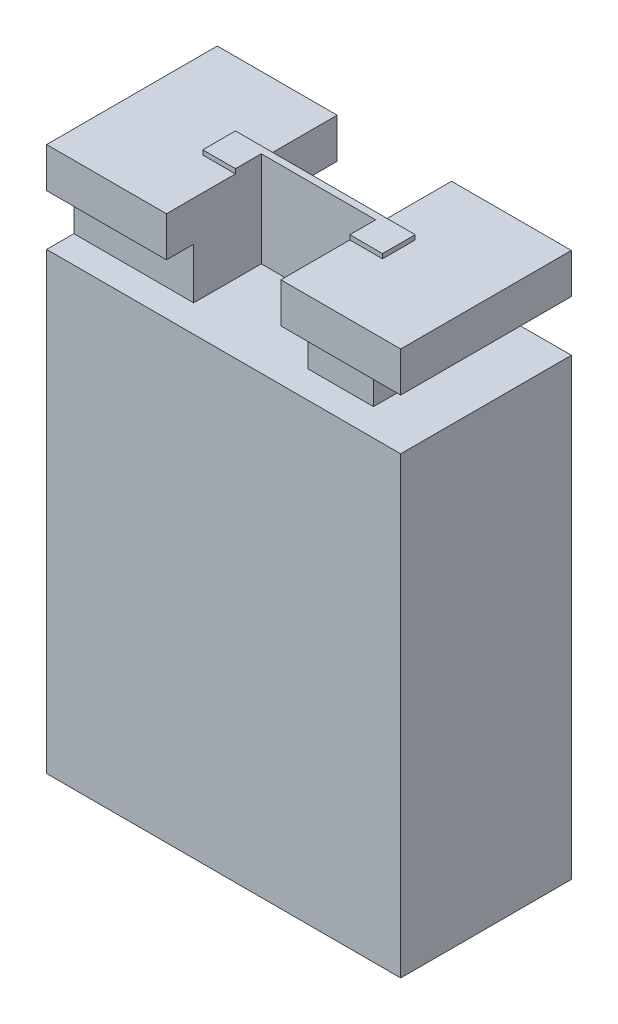
ISO-10303-21;
HEADER;
FILE_DESCRIPTION(('STEP AP214'),'2;1');
FILE_NAME('part.step','',(''),(''),'','','');
FILE_SCHEMA(('AUTOMOTIVE_DESIGN { 1 0 10303 214 1 1 1 1 }'));
ENDSEC;
DATA;
#1=APPLICATION_CONTEXT('core data for automotive mechanical design processes');
#2=APPLICATION_PROTOCOL_DEFINITION('international standard','automotive_design',2000,#1);
#3=PRODUCT_CONTEXT('',#1,'mechanical');
#4=PRODUCT('Part','Part','',(#3));
#5=PRODUCT_RELATED_PRODUCT_CATEGORY('part','',(#4));
#6=PRODUCT_DEFINITION_FORMATION('','',#4);
#7=PRODUCT_DEFINITION_CONTEXT('part definition',#1,'design');
#8=PRODUCT_DEFINITION('design','',#6,#7);
#9=PRODUCT_DEFINITION_SHAPE('','',#8);
#10=(LENGTH_UNIT() NAMED_UNIT(*) SI_UNIT(.MILLI.,.METRE.));
#11=(NAMED_UNIT(*) PLANE_ANGLE_UNIT() SI_UNIT($,.RADIAN.));
#12=(NAMED_UNIT(*) SI_UNIT($,.STERADIAN.) SOLID_ANGLE_UNIT());
#13=UNCERTAINTY_MEASURE_WITH_UNIT(LENGTH_MEASURE(1.E-05),#10,'distance_accuracy_value','');
#14=(GEOMETRIC_REPRESENTATION_CONTEXT(3) GLOBAL_UNCERTAINTY_ASSIGNED_CONTEXT((#13)) GLOBAL_UNIT_ASSIGNED_CONTEXT((#10,
#11,#12)) REPRESENTATION_CONTEXT('',''));
#15=CARTESIAN_POINT('',(0.,0.,0.));
#16=DIRECTION('',(0.,0.,1.));
#17=DIRECTION('',(1.,0.,0.));
#18=AXIS2_PLACEMENT_3D('',#15,#16,#17);
#19=CARTESIAN_POINT('',(2.47649999999999,7.62,-1.19379999999999));
#20=DIRECTION('',(0.,-1.,0.));
#21=DIRECTION('',(0.,0.,-1.));
#22=AXIS2_PLACEMENT_3D('',#19,#20,#21);
#23=PLANE('',#22);
#24=DIRECTION('',(-1.,0.,0.));
#25=VECTOR('',#24,1.);
#26=CARTESIAN_POINT('',(0.8001,7.62,-0.228599999999988));
#27=LINE('',#26,#25);
#28=CARTESIAN_POINT('',(1.2573,7.62,-0.228599999999988));
#29=VERTEX_POINT('',#28);
#30=CARTESIAN_POINT('',(0.8001,7.62,-0.228599999999988));
#31=VERTEX_POINT('',#30);
#32=EDGE_CURVE('E50',#29,#31,#27,.T.);
#33=ORIENTED_EDGE('',*,*,#32,.F.);
#34=DIRECTION('',(0.,0.,-1.));
#35=VECTOR('',#34,1.);
#36=CARTESIAN_POINT('',(1.2573,7.62,-0.228599999999988));
#37=LINE('',#36,#35);
#38=CARTESIAN_POINT('',(1.2573,7.62,0.228600000000012));
#39=VERTEX_POINT('',#38);
#40=EDGE_CURVE('E54',#39,#29,#37,.T.);
#41=ORIENTED_EDGE('',*,*,#40,.F.);
#42=DIRECTION('',(1.,0.,0.));
#43=VECTOR('',#42,1.);
#44=CARTESIAN_POINT('',(0.8001,7.62,0.228600000000012));
#45=LINE('',#44,#43);
#46=CARTESIAN_POINT('',(0.8001,7.62,0.228600000000012));
#47=VERTEX_POINT('',#46);
#48=EDGE_CURVE('E280',#47,#39,#45,.T.);
#49=ORIENTED_EDGE('',*,*,#48,.F.);
#50=DIRECTION('',(0.,0.,-1.));
#51=VECTOR('',#50,1.);
#52=CARTESIAN_POINT('',(0.8001,7.62,1.19380000000001));
#53=LINE('',#52,#51);
#54=CARTESIAN_POINT('',(0.8001,7.62,1.19380000000001));
#55=VERTEX_POINT('',#54);
#56=EDGE_CURVE('E343',#55,#47,#53,.T.);
#57=ORIENTED_EDGE('',*,*,#56,.F.);
#58=DIRECTION('',(1.,0.,0.));
#59=VECTOR('',#58,1.);
#60=CARTESIAN_POINT('',(-2.47649999999999,7.62,1.19380000000001));
#61=LINE('',#60,#59);
#62=CARTESIAN_POINT('',(2.47649999999999,7.62,1.19380000000001));
#63=VERTEX_POINT('',#62);
#64=EDGE_CURVE('E386',#55,#63,#61,.T.);
#65=ORIENTED_EDGE('',*,*,#64,.T.);
#66=DIRECTION('',(0.,0.,-1.));
#67=VECTOR('',#66,1.);
#68=CARTESIAN_POINT('',(2.47649999999999,7.62,1.19380000000001));
#69=LINE('',#68,#67);
#70=CARTESIAN_POINT('',(2.47649999999999,7.62,-1.19379999999999));
#71=VERTEX_POINT('',#70);
#72=EDGE_CURVE('E372',#63,#71,#69,.T.);
#73=ORIENTED_EDGE('',*,*,#72,.T.);
#74=DIRECTION('',(-1.,0.,0.));
#75=VECTOR('',#74,1.);
#76=CARTESIAN_POINT('',(-2.47649999999999,7.62,-1.19379999999999));
#77=LINE('',#76,#75);
#78=CARTESIAN_POINT('',(0.8001,7.62,-1.19379999999999));
#79=VERTEX_POINT('',#78);
#80=EDGE_CURVE('E389',#71,#79,#77,.T.);
#81=ORIENTED_EDGE('',*,*,#80,.T.);
#82=DIRECTION('',(0.,0.,-1.));
#83=VECTOR('',#82,1.);
#84=CARTESIAN_POINT('',(0.8001,7.62,-0.228599999999988));
#85=LINE('',#84,#83);
#86=EDGE_CURVE('E297',#31,#79,#85,.T.);
#87=ORIENTED_EDGE('',*,*,#86,.F.);
#88=EDGE_LOOP('',(#33,#41,#49,#57,#65,#73,#81,#87));
#89=FACE_BOUND('',#88,.T.);
#90=ADVANCED_FACE('F33',(#89),#23,.F.);
#91=CARTESIAN_POINT('',(-0.8001,7.62,-0.228599999999988));
#92=VERTEX_POINT('',#91);
#93=CARTESIAN_POINT('',(-1.2573,7.62,-0.228599999999988));
#94=VERTEX_POINT('',#93);
#95=EDGE_CURVE('E11',#92,#94,#27,.T.);
#96=ORIENTED_EDGE('',*,*,#95,.F.);
#97=DIRECTION('',(0.,0.,1.));
#98=VECTOR('',#97,1.);
#99=CARTESIAN_POINT('',(-0.8001,7.62,-0.228599999999988));
#100=LINE('',#99,#98);
#101=CARTESIAN_POINT('',(-0.8001,7.62,-1.19379999999999));
#102=VERTEX_POINT('',#101);
#103=EDGE_CURVE('E248',#102,#92,#100,.T.);
#104=ORIENTED_EDGE('',*,*,#103,.F.);
#105=CARTESIAN_POINT('',(-2.47649999999999,7.62,-1.19379999999999));
#106=VERTEX_POINT('',#105);
#107=EDGE_CURVE('E392',#102,#106,#77,.T.);
#108=ORIENTED_EDGE('',*,*,#107,.T.);
#109=DIRECTION('',(0.,0.,1.));
#110=VECTOR('',#109,1.);
#111=CARTESIAN_POINT('',(-2.47649999999999,7.62,1.19380000000001));
#112=LINE('',#111,#110);
#113=CARTESIAN_POINT('',(-2.47649999999999,7.62,1.19380000000001));
#114=VERTEX_POINT('',#113);
#115=EDGE_CURVE('E387',#106,#114,#112,.T.);
#116=ORIENTED_EDGE('',*,*,#115,.T.);
#117=CARTESIAN_POINT('',(-0.8001,7.62,1.19380000000001));
#118=VERTEX_POINT('',#117);
#119=EDGE_CURVE('E383',#114,#118,#61,.T.);
#120=ORIENTED_EDGE('',*,*,#119,.T.);
#121=DIRECTION('',(0.,0.,1.));
#122=VECTOR('',#121,1.);
#123=CARTESIAN_POINT('',(-0.8001,7.62,1.19380000000001));
#124=LINE('',#123,#122);
#125=CARTESIAN_POINT('',(-0.8001,7.62,0.228600000000012));
#126=VERTEX_POINT('',#125);
#127=EDGE_CURVE('E338',#126,#118,#124,.T.);
#128=ORIENTED_EDGE('',*,*,#127,.F.);
#129=DIRECTION('',(1.,0.,0.));
#130=VECTOR('',#129,1.);
#131=CARTESIAN_POINT('',(-0.8001,7.62,0.228600000000012));
#132=LINE('',#131,#130);
#133=CARTESIAN_POINT('',(-1.2573,7.62,0.228600000000012));
#134=VERTEX_POINT('',#133);
#135=EDGE_CURVE('E272',#134,#126,#132,.T.);
#136=ORIENTED_EDGE('',*,*,#135,.F.);
#137=DIRECTION('',(0.,0.,1.));
#138=VECTOR('',#137,1.);
#139=CARTESIAN_POINT('',(-1.2573,7.62,-0.228599999999988));
#140=LINE('',#139,#138);
#141=EDGE_CURVE('E270',#94,#134,#140,.T.);
#142=ORIENTED_EDGE('',*,*,#141,.F.);
#143=EDGE_LOOP('',(#96,#104,#108,#116,#120,#128,#136,#142));
#144=FACE_BOUND('',#143,.T.);
#145=ADVANCED_FACE('F532',(#144),#23,.F.);
#146=CARTESIAN_POINT('',(-2.47649999999999,7.0612,1.19380000000001));
#147=DIRECTION('',(0.,1.,0.));
#148=DIRECTION('',(0.,0.,1.));
#149=AXIS2_PLACEMENT_3D('',#146,#147,#148);
#150=PLANE('',#149);
#151=DIRECTION('',(1.,0.,0.));
#152=VECTOR('',#151,1.);
#153=CARTESIAN_POINT('',(-2.47649999999999,7.0612,-0.812799999999988));
#154=LINE('',#153,#152);
#155=CARTESIAN_POINT('',(0.8001,7.0612,-0.812799999999988));
#156=VERTEX_POINT('',#155);
#157=CARTESIAN_POINT('',(1.71449999999999,7.0612,-0.812799999999988));
#158=VERTEX_POINT('',#157);
#159=EDGE_CURVE('E427',#156,#158,#154,.T.);
#160=ORIENTED_EDGE('',*,*,#159,.F.);
#161=DIRECTION('',(0.,0.,-1.));
#162=VECTOR('',#161,1.);
#163=CARTESIAN_POINT('',(0.8001,7.0612,1.19380000000001));
#164=LINE('',#163,#162);
#165=CARTESIAN_POINT('',(0.8001,7.0612,-1.19379999999999));
#166=VERTEX_POINT('',#165);
#167=EDGE_CURVE('E335',#156,#166,#164,.T.);
#168=ORIENTED_EDGE('',*,*,#167,.T.);
#169=DIRECTION('',(1.,0.,0.));
#170=VECTOR('',#169,1.);
#171=CARTESIAN_POINT('',(-2.47649999999999,7.0612,-1.19379999999999));
#172=LINE('',#171,#170);
#173=CARTESIAN_POINT('',(2.47649999999999,7.0612,-1.19379999999999));
#174=VERTEX_POINT('',#173);
#175=EDGE_CURVE('E428',#166,#174,#172,.T.);
#176=ORIENTED_EDGE('',*,*,#175,.T.);
#177=DIRECTION('',(0.,0.,1.));
#178=VECTOR('',#177,1.);
#179=CARTESIAN_POINT('',(2.47649999999999,7.0612,1.19380000000001));
#180=LINE('',#179,#178);
#181=CARTESIAN_POINT('',(2.47649999999999,7.0612,1.19380000000001));
#182=VERTEX_POINT('',#181);
#183=EDGE_CURVE('E409',#174,#182,#180,.T.);
#184=ORIENTED_EDGE('',*,*,#183,.T.);
#185=DIRECTION('',(1.,0.,0.));
#186=VECTOR('',#185,1.);
#187=CARTESIAN_POINT('',(-2.47649999999999,7.0612,1.19380000000001));
#188=LINE('',#187,#186);
#189=CARTESIAN_POINT('',(0.8001,7.0612,1.19380000000001));
#190=VERTEX_POINT('',#189);
#191=EDGE_CURVE('E406',#190,#182,#188,.T.);
#192=ORIENTED_EDGE('',*,*,#191,.F.);
#193=DIRECTION('',(0.,0.,-1.));
#194=VECTOR('',#193,1.);
#195=CARTESIAN_POINT('',(0.8001,7.0612,1.19380000000001));
#196=LINE('',#195,#194);
#197=CARTESIAN_POINT('',(0.8001,7.0612,0.812800000000012));
#198=VERTEX_POINT('',#197);
#199=EDGE_CURVE('E458',#190,#198,#196,.T.);
#200=ORIENTED_EDGE('',*,*,#199,.T.);
#201=DIRECTION('',(1.,0.,0.));
#202=VECTOR('',#201,1.);
#203=CARTESIAN_POINT('',(-2.47649999999999,7.0612,0.812800000000012));
#204=LINE('',#203,#202);
#205=CARTESIAN_POINT('',(1.71449999999999,7.0612,0.812800000000012));
#206=VERTEX_POINT('',#205);
#207=EDGE_CURVE('E402',#198,#206,#204,.T.);
#208=ORIENTED_EDGE('',*,*,#207,.T.);
#209=DIRECTION('',(0.,0.,1.));
#210=VECTOR('',#209,1.);
#211=CARTESIAN_POINT('',(1.71449999999999,7.0612,-1.19479999999999));
#212=LINE('',#211,#210);
#213=EDGE_CURVE('E447',#158,#206,#212,.T.);
#214=ORIENTED_EDGE('',*,*,#213,.F.);
#215=EDGE_LOOP('',(#160,#168,#176,#184,#192,#200,#208,#214));
#216=FACE_BOUND('',#215,.T.);
#217=ADVANCED_FACE('F524',(#216),#150,.F.);
#218=CARTESIAN_POINT('',(-2.47649999999999,7.62,-1.19379999999999));
#219=DIRECTION('',(0.,0.,1.));
#220=DIRECTION('',(1.,0.,0.));
#221=AXIS2_PLACEMENT_3D('',#218,#219,#220);
#222=PLANE('',#221);
#223=ORIENTED_EDGE('',*,*,#175,.F.);
#224=DIRECTION('',(0.,1.,0.));
#225=VECTOR('',#224,1.);
#226=CARTESIAN_POINT('',(0.8001,4.27174834131522,-1.19379999999999));
#227=LINE('',#226,#225);
#228=EDGE_CURVE('E329',#166,#79,#227,.T.);
#229=ORIENTED_EDGE('',*,*,#228,.T.);
#230=ORIENTED_EDGE('',*,*,#80,.F.);
#231=DIRECTION('',(0.,-1.,0.));
#232=VECTOR('',#231,1.);
#233=CARTESIAN_POINT('',(2.47649999999999,7.62,-1.19379999999999));
#234=LINE('',#233,#232);
#235=EDGE_CURVE('E353',#71,#174,#234,.T.);
#236=ORIENTED_EDGE('',*,*,#235,.T.);
#237=EDGE_LOOP('',(#223,#229,#230,#236));
#238=FACE_BOUND('',#237,.T.);
#239=ADVANCED_FACE('F654',(#238),#222,.F.);
#240=CARTESIAN_POINT('',(-2.47649999999999,7.0612,-0.812799999999988));
#241=DIRECTION('',(0.,0.,1.));
#242=DIRECTION('',(0.,-1.,0.));
#243=AXIS2_PLACEMENT_3D('',#240,#241,#242);
#244=PLANE('',#243);
#245=DIRECTION('',(1.,0.,0.));
#246=VECTOR('',#245,1.);
#247=CARTESIAN_POINT('',(-2.47649999999999,6.35,-0.812799999999988));
#248=LINE('',#247,#246);
#249=CARTESIAN_POINT('',(0.8001,6.35,-0.812799999999988));
#250=VERTEX_POINT('',#249);
#251=CARTESIAN_POINT('',(1.71449999999999,6.35,-0.812799999999988));
#252=VERTEX_POINT('',#251);
#253=EDGE_CURVE('E432',#250,#252,#248,.T.);
#254=ORIENTED_EDGE('',*,*,#253,.F.);
#255=DIRECTION('',(0.,1.,0.));
#256=VECTOR('',#255,1.);
#257=CARTESIAN_POINT('',(0.8001,7.0612,-0.812799999999988));
#258=LINE('',#257,#256);
#259=EDGE_CURVE('E42',#250,#156,#258,.T.);
#260=ORIENTED_EDGE('',*,*,#259,.T.);
#261=ORIENTED_EDGE('',*,*,#159,.T.);
#262=DIRECTION('',(0.,1.,0.));
#263=VECTOR('',#262,1.);
#264=CARTESIAN_POINT('',(1.71449999999999,6.35,-0.812799999999988));
#265=LINE('',#264,#263);
#266=EDGE_CURVE('E455',#252,#158,#265,.T.);
#267=ORIENTED_EDGE('',*,*,#266,.F.);
#268=EDGE_LOOP('',(#254,#260,#261,#267));
#269=FACE_BOUND('',#268,.T.);
#270=ADVANCED_FACE('F548',(#269),#244,.F.);
#271=CARTESIAN_POINT('',(-2.47649999999999,7.62,1.19380000000001));
#272=DIRECTION('',(0.,0.,-1.));
#273=DIRECTION('',(-1.,0.,0.));
#274=AXIS2_PLACEMENT_3D('',#271,#272,#273);
#275=PLANE('',#274);
#276=ORIENTED_EDGE('',*,*,#64,.F.);
#277=DIRECTION('',(0.,1.,0.));
#278=VECTOR('',#277,1.);
#279=CARTESIAN_POINT('',(0.8001,4.27174834131522,1.19380000000001));
#280=LINE('',#279,#278);
#281=EDGE_CURVE('E346',#190,#55,#280,.T.);
#282=ORIENTED_EDGE('',*,*,#281,.F.);
#283=ORIENTED_EDGE('',*,*,#191,.T.);
#284=DIRECTION('',(0.,-1.,0.));
#285=VECTOR('',#284,1.);
#286=CARTESIAN_POINT('',(2.47649999999999,7.62,1.19380000000001));
#287=LINE('',#286,#285);
#288=EDGE_CURVE('E365',#63,#182,#287,.T.);
#289=ORIENTED_EDGE('',*,*,#288,.F.);
#290=EDGE_LOOP('',(#276,#282,#283,#289));
#291=FACE_BOUND('',#290,.T.);
#292=ADVANCED_FACE('F528',(#291),#275,.F.);
#293=CARTESIAN_POINT('',(-2.47649999999999,7.0612,-1.19379999999999));
#294=VERTEX_POINT('',#293);
#295=CARTESIAN_POINT('',(-0.8001,7.0612,-1.19379999999999));
#296=VERTEX_POINT('',#295);
#297=EDGE_CURVE('E424',#294,#296,#172,.T.);
#298=ORIENTED_EDGE('',*,*,#297,.T.);
#299=DIRECTION('',(0.,0.,1.));
#300=VECTOR('',#299,1.);
#301=CARTESIAN_POINT('',(-0.8001,7.0612,1.19380000000001));
#302=LINE('',#301,#300);
#303=CARTESIAN_POINT('',(-0.8001,7.0612,-0.812799999999988));
#304=VERTEX_POINT('',#303);
#305=EDGE_CURVE('E291',#296,#304,#302,.T.);
#306=ORIENTED_EDGE('',*,*,#305,.T.);
#307=CARTESIAN_POINT('',(-2.47649999999999,7.0612,-0.812799999999988));
#308=VERTEX_POINT('',#307);
#309=EDGE_CURVE('E429',#308,#304,#154,.T.);
#310=ORIENTED_EDGE('',*,*,#309,.F.);
#311=DIRECTION('',(0.,0.,1.));
#312=VECTOR('',#311,1.);
#313=CARTESIAN_POINT('',(-2.47649999999999,7.0612,-1.19379999999999));
#314=LINE('',#313,#312);
#315=EDGE_CURVE('E443',#294,#308,#314,.T.);
#316=ORIENTED_EDGE('',*,*,#315,.F.);
#317=EDGE_LOOP('',(#298,#306,#310,#316));
#318=FACE_BOUND('',#317,.T.);
#319=ADVANCED_FACE('F525',(#318),#150,.F.);
#320=CARTESIAN_POINT('',(-2.47649999999999,7.0612,0.812800000000012));
#321=DIRECTION('',(0.,0.,-1.));
#322=DIRECTION('',(-1.,0.,0.));
#323=AXIS2_PLACEMENT_3D('',#320,#321,#322);
#324=PLANE('',#323);
#325=ORIENTED_EDGE('',*,*,#207,.F.);
#326=DIRECTION('',(0.,-1.,0.));
#327=VECTOR('',#326,1.);
#328=CARTESIAN_POINT('',(0.8001,7.0612,0.812800000000012));
#329=LINE('',#328,#327);
#330=CARTESIAN_POINT('',(0.8001,6.35,0.812800000000012));
#331=VERTEX_POINT('',#330);
#332=EDGE_CURVE('E461',#198,#331,#329,.T.);
#333=ORIENTED_EDGE('',*,*,#332,.T.);
#334=DIRECTION('',(1.,0.,0.));
#335=VECTOR('',#334,1.);
#336=CARTESIAN_POINT('',(-2.47649999999999,6.35,0.812800000000012));
#337=LINE('',#336,#335);
#338=CARTESIAN_POINT('',(1.71449999999999,6.35,0.812800000000012));
#339=VERTEX_POINT('',#338);
#340=EDGE_CURVE('E397',#331,#339,#337,.T.);
#341=ORIENTED_EDGE('',*,*,#340,.T.);
#342=DIRECTION('',(0.,-1.,0.));
#343=VECTOR('',#342,1.);
#344=CARTESIAN_POINT('',(1.71449999999999,6.35,0.812800000000012));
#345=LINE('',#344,#343);
#346=EDGE_CURVE('E450',#206,#339,#345,.T.);
#347=ORIENTED_EDGE('',*,*,#346,.F.);
#348=EDGE_LOOP('',(#325,#333,#341,#347));
#349=FACE_BOUND('',#348,.T.);
#350=ADVANCED_FACE('F543',(#349),#324,.F.);
#351=CARTESIAN_POINT('',(2.47649999999999,7.62,1.19380000000001));
#352=DIRECTION('',(-1.,0.,0.));
#353=DIRECTION('',(0.,0.,1.));
#354=AXIS2_PLACEMENT_3D('',#351,#352,#353);
#355=PLANE('',#354);
#356=CARTESIAN_POINT('',(2.47649999999999,6.35,-1.19379999999999));
#357=VERTEX_POINT('',#356);
#358=CARTESIAN_POINT('',(2.47649999999999,0.,-1.19379999999999));
#359=VERTEX_POINT('',#358);
#360=EDGE_CURVE('E356',#357,#359,#234,.T.);
#361=ORIENTED_EDGE('',*,*,#360,.F.);
#362=DIRECTION('',(0.,0.,-1.));
#363=VECTOR('',#362,1.);
#364=CARTESIAN_POINT('',(2.47649999999999,6.35,1.19380000000001));
#365=LINE('',#364,#363);
#366=CARTESIAN_POINT('',(2.47649999999999,6.35,1.19380000000001));
#367=VERTEX_POINT('',#366);
#368=EDGE_CURVE('E413',#367,#357,#365,.T.);
#369=ORIENTED_EDGE('',*,*,#368,.F.);
#370=CARTESIAN_POINT('',(2.47649999999999,0.,1.19380000000001));
#371=VERTEX_POINT('',#370);
#372=EDGE_CURVE('E368',#367,#371,#287,.T.);
#373=ORIENTED_EDGE('',*,*,#372,.T.);
#374=DIRECTION('',(0.,0.,-1.));
#375=VECTOR('',#374,1.);
#376=CARTESIAN_POINT('',(2.47649999999999,0.,1.19380000000001));
#377=LINE('',#376,#375);
#378=EDGE_CURVE('E379',#371,#359,#377,.T.);
#379=ORIENTED_EDGE('',*,*,#378,.T.);
#380=EDGE_LOOP('',(#361,#369,#373,#379));
#381=FACE_BOUND('',#380,.T.);
#382=ADVANCED_FACE('F505',(#381),#355,.F.);
#383=DIRECTION('',(0.,-1.,0.));
#384=VECTOR('',#383,1.);
#385=CARTESIAN_POINT('',(-2.47649999999999,7.62,-1.19379999999999));
#386=LINE('',#385,#384);
#387=CARTESIAN_POINT('',(-2.47649999999999,6.35,-1.19379999999999));
#388=VERTEX_POINT('',#387);
#389=CARTESIAN_POINT('',(-2.47649999999999,0.,-1.19379999999999));
#390=VERTEX_POINT('',#389);
#391=EDGE_CURVE('E360',#388,#390,#386,.T.);
#392=ORIENTED_EDGE('',*,*,#391,.F.);
#393=DIRECTION('',(1.,0.,0.));
#394=VECTOR('',#393,1.);
#395=CARTESIAN_POINT('',(-2.47649999999999,6.35,-1.19379999999999));
#396=LINE('',#395,#394);
#397=EDGE_CURVE('E416',#388,#357,#396,.T.);
#398=ORIENTED_EDGE('',*,*,#397,.T.);
#399=ORIENTED_EDGE('',*,*,#360,.T.);
#400=DIRECTION('',(-1.,0.,0.));
#401=VECTOR('',#400,1.);
#402=CARTESIAN_POINT('',(-2.47649999999999,0.,-1.19379999999999));
#403=LINE('',#402,#401);
#404=EDGE_CURVE('E376',#359,#390,#403,.T.);
#405=ORIENTED_EDGE('',*,*,#404,.T.);
#406=EDGE_LOOP('',(#392,#398,#399,#405));
#407=FACE_BOUND('',#406,.T.);
#408=ADVANCED_FACE('F509',(#407),#222,.F.);
#409=CARTESIAN_POINT('',(-2.47649999999999,7.0612,1.19380000000001));
#410=VERTEX_POINT('',#409);
#411=CARTESIAN_POINT('',(-0.8001,7.0612,1.19380000000001));
#412=VERTEX_POINT('',#411);
#413=EDGE_CURVE('E382',#410,#412,#188,.T.);
#414=ORIENTED_EDGE('',*,*,#413,.T.);
#415=DIRECTION('',(0.,1.,0.));
#416=VECTOR('',#415,1.);
#417=CARTESIAN_POINT('',(-0.8001,4.27174834131522,1.19380000000001));
#418=LINE('',#417,#416);
#419=EDGE_CURVE('E470',#412,#118,#418,.T.);
#420=ORIENTED_EDGE('',*,*,#419,.T.);
#421=ORIENTED_EDGE('',*,*,#119,.F.);
#422=DIRECTION('',(0.,-1.,0.));
#423=VECTOR('',#422,1.);
#424=CARTESIAN_POINT('',(-2.47649999999999,7.62,1.19380000000001));
#425=LINE('',#424,#423);
#426=EDGE_CURVE('E361',#114,#410,#425,.T.);
#427=ORIENTED_EDGE('',*,*,#426,.T.);
#428=EDGE_LOOP('',(#414,#420,#421,#427));
#429=FACE_BOUND('',#428,.T.);
#430=ADVANCED_FACE('F529',(#429),#275,.F.);
#431=ORIENTED_EDGE('',*,*,#183,.F.);
#432=ORIENTED_EDGE('',*,*,#235,.F.);
#433=ORIENTED_EDGE('',*,*,#72,.F.);
#434=ORIENTED_EDGE('',*,*,#288,.T.);
#435=EDGE_LOOP('',(#431,#432,#433,#434));
#436=FACE_BOUND('',#435,.T.);
#437=ADVANCED_FACE('F35',(#436),#355,.F.);
#438=ORIENTED_EDGE('',*,*,#107,.F.);
#439=DIRECTION('',(0.,1.,0.));
#440=VECTOR('',#439,1.);
#441=CARTESIAN_POINT('',(-0.8001,4.27174834131522,-1.19379999999999));
#442=LINE('',#441,#440);
#443=EDGE_CURVE('E326',#296,#102,#442,.T.);
#444=ORIENTED_EDGE('',*,*,#443,.F.);
#445=ORIENTED_EDGE('',*,*,#297,.F.);
#446=EDGE_CURVE('E357',#106,#294,#386,.T.);
#447=ORIENTED_EDGE('',*,*,#446,.F.);
#448=EDGE_LOOP('',(#438,#444,#445,#447));
#449=FACE_BOUND('',#448,.T.);
#450=ADVANCED_FACE('F666',(#449),#222,.F.);
#451=CARTESIAN_POINT('',(-2.47649999999999,7.62,1.19380000000001));
#452=DIRECTION('',(1.,0.,0.));
#453=DIRECTION('',(0.,0.,-1.));
#454=AXIS2_PLACEMENT_3D('',#451,#452,#453);
#455=PLANE('',#454);
#456=DIRECTION('',(0.,-1.,0.));
#457=VECTOR('',#456,1.);
#458=CARTESIAN_POINT('',(-2.47649999999999,7.0612,-0.812799999999988));
#459=LINE('',#458,#457);
#460=CARTESIAN_POINT('',(-2.47649999999999,6.35,-0.812799999999988));
#461=VERTEX_POINT('',#460);
#462=EDGE_CURVE('E440',#308,#461,#459,.T.);
#463=ORIENTED_EDGE('',*,*,#462,.T.);
#464=DIRECTION('',(0.,0.,-1.));
#465=VECTOR('',#464,1.);
#466=CARTESIAN_POINT('',(-2.47649999999999,6.35,-1.19379999999999));
#467=LINE('',#466,#465);
#468=EDGE_CURVE('E437',#461,#388,#467,.T.);
#469=ORIENTED_EDGE('',*,*,#468,.T.);
#470=ORIENTED_EDGE('',*,*,#391,.T.);
#471=DIRECTION('',(0.,0.,1.));
#472=VECTOR('',#471,1.);
#473=CARTESIAN_POINT('',(-2.47649999999999,0.,1.19380000000001));
#474=LINE('',#473,#472);
#475=CARTESIAN_POINT('',(-2.47649999999999,0.,1.19380000000001));
#476=VERTEX_POINT('',#475);
#477=EDGE_CURVE('E373',#390,#476,#474,.T.);
#478=ORIENTED_EDGE('',*,*,#477,.T.);
#479=CARTESIAN_POINT('',(-2.47649999999999,6.35,1.19380000000001));
#480=VERTEX_POINT('',#479);
#481=EDGE_CURVE('E364',#480,#476,#425,.T.);
#482=ORIENTED_EDGE('',*,*,#481,.F.);
#483=DIRECTION('',(0.,0.,-1.));
#484=VECTOR('',#483,1.);
#485=CARTESIAN_POINT('',(-2.47649999999999,6.35,1.19380000000001));
#486=LINE('',#485,#484);
#487=CARTESIAN_POINT('',(-2.47649999999999,6.35,0.812800000000012));
#488=VERTEX_POINT('',#487);
#489=EDGE_CURVE('E412',#480,#488,#486,.T.);
#490=ORIENTED_EDGE('',*,*,#489,.T.);
#491=DIRECTION('',(0.,1.,0.));
#492=VECTOR('',#491,1.);
#493=CARTESIAN_POINT('',(-2.47649999999999,7.0612,0.812800000000012));
#494=LINE('',#493,#492);
#495=CARTESIAN_POINT('',(-2.47649999999999,7.0612,0.812800000000012));
#496=VERTEX_POINT('',#495);
#497=EDGE_CURVE('E419',#488,#496,#494,.T.);
#498=ORIENTED_EDGE('',*,*,#497,.T.);
#499=DIRECTION('',(0.,0.,1.));
#500=VECTOR('',#499,1.);
#501=CARTESIAN_POINT('',(-2.47649999999999,7.0612,1.19380000000001));
#502=LINE('',#501,#500);
#503=EDGE_CURVE('E398',#496,#410,#502,.T.);
#504=ORIENTED_EDGE('',*,*,#503,.T.);
#505=ORIENTED_EDGE('',*,*,#426,.F.);
#506=ORIENTED_EDGE('',*,*,#115,.F.);
#507=ORIENTED_EDGE('',*,*,#446,.T.);
#508=ORIENTED_EDGE('',*,*,#315,.T.);
#509=EDGE_LOOP('',(#463,#469,#470,#478,#482,#490,#498,#504,#505,#506,#507,#508));
#510=FACE_BOUND('',#509,.T.);
#511=ADVANCED_FACE('F495',(#510),#455,.F.);
#512=ORIENTED_EDGE('',*,*,#372,.F.);
#513=DIRECTION('',(1.,0.,0.));
#514=VECTOR('',#513,1.);
#515=CARTESIAN_POINT('',(-2.47649999999999,6.35,1.19380000000001));
#516=LINE('',#515,#514);
#517=EDGE_CURVE('E395',#480,#367,#516,.T.);
#518=ORIENTED_EDGE('',*,*,#517,.F.);
#519=ORIENTED_EDGE('',*,*,#481,.T.);
#520=DIRECTION('',(1.,0.,0.));
#521=VECTOR('',#520,1.);
#522=CARTESIAN_POINT('',(-2.47649999999999,0.,1.19380000000001));
#523=LINE('',#522,#521);
#524=EDGE_CURVE('E369',#476,#371,#523,.T.);
#525=ORIENTED_EDGE('',*,*,#524,.T.);
#526=EDGE_LOOP('',(#512,#518,#519,#525));
#527=FACE_BOUND('',#526,.T.);
#528=ADVANCED_FACE('F500',(#527),#275,.F.);
#529=CARTESIAN_POINT('',(2.47649999999999,0.,-1.19379999999999));
#530=DIRECTION('',(0.,-1.,0.));
#531=DIRECTION('',(0.,0.,-1.));
#532=AXIS2_PLACEMENT_3D('',#529,#530,#531);
#533=PLANE('',#532);
#534=ORIENTED_EDGE('',*,*,#378,.F.);
#535=ORIENTED_EDGE('',*,*,#524,.F.);
#536=ORIENTED_EDGE('',*,*,#477,.F.);
#537=ORIENTED_EDGE('',*,*,#404,.F.);
#538=EDGE_LOOP('',(#534,#535,#536,#537));
#539=FACE_BOUND('',#538,.T.);
#540=ADVANCED_FACE('F513',(#539),#533,.T.);
#541=CARTESIAN_POINT('',(-0.8001,7.0612,0.812800000000012));
#542=VERTEX_POINT('',#541);
#543=EDGE_CURVE('E403',#496,#542,#204,.T.);
#544=ORIENTED_EDGE('',*,*,#543,.T.);
#545=DIRECTION('',(0.,0.,1.));
#546=VECTOR('',#545,1.);
#547=CARTESIAN_POINT('',(-0.8001,7.0612,1.19380000000001));
#548=LINE('',#547,#546);
#549=EDGE_CURVE('E464',#542,#412,#548,.T.);
#550=ORIENTED_EDGE('',*,*,#549,.T.);
#551=ORIENTED_EDGE('',*,*,#413,.F.);
#552=ORIENTED_EDGE('',*,*,#503,.F.);
#553=EDGE_LOOP('',(#544,#550,#551,#552));
#554=FACE_BOUND('',#553,.T.);
#555=ADVANCED_FACE('F515',(#554),#150,.F.);
#556=CARTESIAN_POINT('',(-0.8001,6.35,0.812800000000012));
#557=VERTEX_POINT('',#556);
#558=EDGE_CURVE('E399',#488,#557,#337,.T.);
#559=ORIENTED_EDGE('',*,*,#558,.T.);
#560=DIRECTION('',(0.,1.,0.));
#561=VECTOR('',#560,1.);
#562=CARTESIAN_POINT('',(-0.8001,7.0612,0.812800000000012));
#563=LINE('',#562,#561);
#564=EDGE_CURVE('E467',#557,#542,#563,.T.);
#565=ORIENTED_EDGE('',*,*,#564,.T.);
#566=ORIENTED_EDGE('',*,*,#543,.F.);
#567=ORIENTED_EDGE('',*,*,#497,.F.);
#568=EDGE_LOOP('',(#559,#565,#566,#567));
#569=FACE_BOUND('',#568,.T.);
#570=ADVANCED_FACE('F491',(#569),#324,.F.);
#571=CARTESIAN_POINT('',(-2.47649999999999,6.35,1.19380000000001));
#572=DIRECTION('',(0.,-1.,0.));
#573=DIRECTION('',(0.,0.,-1.));
#574=AXIS2_PLACEMENT_3D('',#571,#572,#573);
#575=PLANE('',#574);
#576=CARTESIAN_POINT('',(-0.8001,6.35,-0.812799999999988));
#577=VERTEX_POINT('',#576);
#578=EDGE_CURVE('E433',#461,#577,#248,.T.);
#579=ORIENTED_EDGE('',*,*,#578,.T.);
#580=DIRECTION('',(0.,0.,1.));
#581=VECTOR('',#580,1.);
#582=CARTESIAN_POINT('',(-0.8001,6.35,-0.228599999999988));
#583=LINE('',#582,#581);
#584=CARTESIAN_POINT('',(-0.8001,6.35,-0.228599999999988));
#585=VERTEX_POINT('',#584);
#586=EDGE_CURVE('E292',#577,#585,#583,.T.);
#587=ORIENTED_EDGE('',*,*,#586,.T.);
#588=DIRECTION('',(1.,0.,0.));
#589=VECTOR('',#588,1.);
#590=CARTESIAN_POINT('',(-0.8001,6.35,-0.228599999999988));
#591=LINE('',#590,#589);
#592=CARTESIAN_POINT('',(0.8001,6.35,-0.228599999999988));
#593=VERTEX_POINT('',#592);
#594=EDGE_CURVE('E303',#585,#593,#591,.T.);
#595=ORIENTED_EDGE('',*,*,#594,.T.);
#596=DIRECTION('',(0.,0.,-1.));
#597=VECTOR('',#596,1.);
#598=CARTESIAN_POINT('',(0.8001,6.35,-0.228599999999988));
#599=LINE('',#598,#597);
#600=EDGE_CURVE('E302',#593,#250,#599,.T.);
#601=ORIENTED_EDGE('',*,*,#600,.T.);
#602=ORIENTED_EDGE('',*,*,#253,.T.);
#603=DIRECTION('',(0.,0.,1.));
#604=VECTOR('',#603,1.);
#605=CARTESIAN_POINT('',(1.71449999999999,6.35,-1.19479999999999));
#606=LINE('',#605,#604);
#607=EDGE_CURVE('E446',#252,#339,#606,.T.);
#608=ORIENTED_EDGE('',*,*,#607,.T.);
#609=ORIENTED_EDGE('',*,*,#340,.F.);
#610=DIRECTION('',(0.,0.,-1.));
#611=VECTOR('',#610,1.);
#612=CARTESIAN_POINT('',(0.8001,6.35,1.19380000000001));
#613=LINE('',#612,#611);
#614=CARTESIAN_POINT('',(0.8001,6.35,-0.132280659999989));
#615=VERTEX_POINT('',#614);
#616=EDGE_CURVE('E475',#331,#615,#613,.T.);
#617=ORIENTED_EDGE('',*,*,#616,.T.);
#618=DIRECTION('',(-1.,0.,0.));
#619=VECTOR('',#618,1.);
#620=CARTESIAN_POINT('',(-0.8001,6.35,-0.132280659999988));
#621=LINE('',#620,#619);
#622=CARTESIAN_POINT('',(-0.8001,6.35,-0.132280659999988));
#623=VERTEX_POINT('',#622);
#624=EDGE_CURVE('E478',#615,#623,#621,.T.);
#625=ORIENTED_EDGE('',*,*,#624,.T.);
#626=DIRECTION('',(0.,0.,1.));
#627=VECTOR('',#626,1.);
#628=CARTESIAN_POINT('',(-0.8001,6.35,1.19380000000001));
#629=LINE('',#628,#627);
#630=EDGE_CURVE('E473',#623,#557,#629,.T.);
#631=ORIENTED_EDGE('',*,*,#630,.T.);
#632=ORIENTED_EDGE('',*,*,#558,.F.);
#633=ORIENTED_EDGE('',*,*,#489,.F.);
#634=ORIENTED_EDGE('',*,*,#517,.T.);
#635=ORIENTED_EDGE('',*,*,#368,.T.);
#636=ORIENTED_EDGE('',*,*,#397,.F.);
#637=ORIENTED_EDGE('',*,*,#468,.F.);
#638=EDGE_LOOP('',(#579,#587,#595,#601,#602,#608,#609,#617,#625,#631,#632,#633,#634,#635,#636,#637));
#639=FACE_BOUND('',#638,.T.);
#640=ADVANCED_FACE('F485',(#639),#575,.F.);
#641=ORIENTED_EDGE('',*,*,#309,.T.);
#642=DIRECTION('',(0.,-1.,0.));
#643=VECTOR('',#642,1.);
#644=CARTESIAN_POINT('',(-0.8001,7.0612,-0.812799999999988));
#645=LINE('',#644,#643);
#646=EDGE_CURVE('E350',#304,#577,#645,.T.);
#647=ORIENTED_EDGE('',*,*,#646,.T.);
#648=ORIENTED_EDGE('',*,*,#578,.F.);
#649=ORIENTED_EDGE('',*,*,#462,.F.);
#650=EDGE_LOOP('',(#641,#647,#648,#649));
#651=FACE_BOUND('',#650,.T.);
#652=ADVANCED_FACE('F541',(#651),#244,.F.);
#653=CARTESIAN_POINT('',(1.71449999999999,6.35,-1.19479999999999));
#654=DIRECTION('',(-1.,0.,0.));
#655=DIRECTION('',(0.,0.,1.));
#656=AXIS2_PLACEMENT_3D('',#653,#654,#655);
#657=PLANE('',#656);
#658=ORIENTED_EDGE('',*,*,#266,.T.);
#659=ORIENTED_EDGE('',*,*,#213,.T.);
#660=ORIENTED_EDGE('',*,*,#346,.T.);
#661=ORIENTED_EDGE('',*,*,#607,.F.);
#662=EDGE_LOOP('',(#658,#659,#660,#661));
#663=FACE_BOUND('',#662,.T.);
#664=ADVANCED_FACE('F546',(#663),#657,.F.);
#665=CARTESIAN_POINT('',(0.8001,4.27174834131522,1.19380000000001));
#666=DIRECTION('',(1.,0.,0.));
#667=DIRECTION('',(0.,0.,-1.));
#668=AXIS2_PLACEMENT_3D('',#665,#666,#667);
#669=PLANE('',#668);
#670=ORIENTED_EDGE('',*,*,#281,.T.);
#671=ORIENTED_EDGE('',*,*,#56,.T.);
#672=DIRECTION('',(0.,-1.,0.));
#673=VECTOR('',#672,1.);
#674=CARTESIAN_POINT('',(0.8001,7.6835,0.228600000000012));
#675=LINE('',#674,#673);
#676=CARTESIAN_POINT('',(0.8001,7.6835,0.228600000000012));
#677=VERTEX_POINT('',#676);
#678=EDGE_CURVE('E286',#677,#47,#675,.T.);
#679=ORIENTED_EDGE('',*,*,#678,.F.);
#680=DIRECTION('',(0.,0.,1.));
#681=VECTOR('',#680,1.);
#682=CARTESIAN_POINT('',(0.8001,7.6835,-0.132280659999988));
#683=LINE('',#682,#681);
#684=CARTESIAN_POINT('',(0.8001,7.6835,-0.132280659999988));
#685=VERTEX_POINT('',#684);
#686=EDGE_CURVE('E264',#685,#677,#683,.T.);
#687=ORIENTED_EDGE('',*,*,#686,.F.);
#688=DIRECTION('',(0.,1.,0.));
#689=VECTOR('',#688,1.);
#690=CARTESIAN_POINT('',(0.8001,4.27174834131522,-0.132280659999988));
#691=LINE('',#690,#689);
#692=EDGE_CURVE('E476',#615,#685,#691,.T.);
#693=ORIENTED_EDGE('',*,*,#692,.F.);
#694=ORIENTED_EDGE('',*,*,#616,.F.);
#695=ORIENTED_EDGE('',*,*,#332,.F.);
#696=ORIENTED_EDGE('',*,*,#199,.F.);
#697=EDGE_LOOP('',(#670,#671,#679,#687,#693,#694,#695,#696));
#698=FACE_BOUND('',#697,.T.);
#699=ADVANCED_FACE('F551',(#698),#669,.F.);
#700=CARTESIAN_POINT('',(-0.8001,4.27174834131522,1.19380000000001));
#701=DIRECTION('',(-1.,0.,0.));
#702=DIRECTION('',(0.,0.,1.));
#703=AXIS2_PLACEMENT_3D('',#700,#701,#702);
#704=PLANE('',#703);
#705=ORIENTED_EDGE('',*,*,#564,.F.);
#706=ORIENTED_EDGE('',*,*,#630,.F.);
#707=DIRECTION('',(0.,1.,0.));
#708=VECTOR('',#707,1.);
#709=CARTESIAN_POINT('',(-0.8001,4.27174834131522,-0.132280659999988));
#710=LINE('',#709,#708);
#711=CARTESIAN_POINT('',(-0.8001,7.6835,-0.132280659999988));
#712=VERTEX_POINT('',#711);
#713=EDGE_CURVE('E479',#623,#712,#710,.T.);
#714=ORIENTED_EDGE('',*,*,#713,.T.);
#715=DIRECTION('',(0.,0.,-1.));
#716=VECTOR('',#715,1.);
#717=CARTESIAN_POINT('',(-0.8001,7.6835,-0.132280659999988));
#718=LINE('',#717,#716);
#719=CARTESIAN_POINT('',(-0.8001,7.6835,0.228600000000012));
#720=VERTEX_POINT('',#719);
#721=EDGE_CURVE('E256',#720,#712,#718,.T.);
#722=ORIENTED_EDGE('',*,*,#721,.F.);
#723=DIRECTION('',(0.,-1.,0.));
#724=VECTOR('',#723,1.);
#725=CARTESIAN_POINT('',(-0.8001,7.6835,0.228600000000012));
#726=LINE('',#725,#724);
#727=EDGE_CURVE('E283',#720,#126,#726,.T.);
#728=ORIENTED_EDGE('',*,*,#727,.T.);
#729=ORIENTED_EDGE('',*,*,#127,.T.);
#730=ORIENTED_EDGE('',*,*,#419,.F.);
#731=ORIENTED_EDGE('',*,*,#549,.F.);
#732=EDGE_LOOP('',(#705,#706,#714,#722,#728,#729,#730,#731));
#733=FACE_BOUND('',#732,.T.);
#734=ADVANCED_FACE('F555',(#733),#704,.F.);
#735=CARTESIAN_POINT('',(-0.8001,4.27174834131522,-0.132280659999988));
#736=DIRECTION('',(0.,0.,-1.));
#737=DIRECTION('',(-1.,0.,0.));
#738=AXIS2_PLACEMENT_3D('',#735,#736,#737);
#739=PLANE('',#738);
#740=ORIENTED_EDGE('',*,*,#692,.T.);
#741=DIRECTION('',(1.,0.,0.));
#742=VECTOR('',#741,1.);
#743=CARTESIAN_POINT('',(-0.8001,7.6835,-0.132280659999988));
#744=LINE('',#743,#742);
#745=EDGE_CURVE('E261',#712,#685,#744,.T.);
#746=ORIENTED_EDGE('',*,*,#745,.F.);
#747=ORIENTED_EDGE('',*,*,#713,.F.);
#748=ORIENTED_EDGE('',*,*,#624,.F.);
#749=EDGE_LOOP('',(#740,#746,#747,#748));
#750=FACE_BOUND('',#749,.T.);
#751=ADVANCED_FACE('F557',(#750),#739,.F.);
#752=CARTESIAN_POINT('',(0.8001,4.27174834131522,-0.228599999999988));
#753=DIRECTION('',(1.,0.,0.));
#754=DIRECTION('',(0.,0.,-1.));
#755=AXIS2_PLACEMENT_3D('',#752,#753,#754);
#756=PLANE('',#755);
#757=ORIENTED_EDGE('',*,*,#259,.F.);
#758=ORIENTED_EDGE('',*,*,#600,.F.);
#759=DIRECTION('',(0.,1.,0.));
#760=VECTOR('',#759,1.);
#761=CARTESIAN_POINT('',(0.8001,4.27174834131522,-0.228599999999988));
#762=LINE('',#761,#760);
#763=EDGE_CURVE('E300',#593,#31,#762,.T.);
#764=ORIENTED_EDGE('',*,*,#763,.T.);
#765=ORIENTED_EDGE('',*,*,#86,.T.);
#766=ORIENTED_EDGE('',*,*,#228,.F.);
#767=ORIENTED_EDGE('',*,*,#167,.F.);
#768=EDGE_LOOP('',(#757,#758,#764,#765,#766,#767));
#769=FACE_BOUND('',#768,.T.);
#770=ADVANCED_FACE('F560',(#769),#756,.F.);
#771=CARTESIAN_POINT('',(-0.8001,4.27174834131522,-0.228599999999988));
#772=DIRECTION('',(-1.,0.,0.));
#773=DIRECTION('',(0.,0.,1.));
#774=AXIS2_PLACEMENT_3D('',#771,#772,#773);
#775=PLANE('',#774);
#776=ORIENTED_EDGE('',*,*,#443,.T.);
#777=ORIENTED_EDGE('',*,*,#103,.T.);
#778=DIRECTION('',(0.,1.,0.));
#779=VECTOR('',#778,1.);
#780=CARTESIAN_POINT('',(-0.8001,4.27174834131522,-0.228599999999988));
#781=LINE('',#780,#779);
#782=EDGE_CURVE('E289',#585,#92,#781,.T.);
#783=ORIENTED_EDGE('',*,*,#782,.F.);
#784=ORIENTED_EDGE('',*,*,#586,.F.);
#785=ORIENTED_EDGE('',*,*,#646,.F.);
#786=ORIENTED_EDGE('',*,*,#305,.F.);
#787=EDGE_LOOP('',(#776,#777,#783,#784,#785,#786));
#788=FACE_BOUND('',#787,.T.);
#789=ADVANCED_FACE('F566',(#788),#775,.F.);
#790=CARTESIAN_POINT('',(-0.8001,4.27174834131522,-0.228599999999988));
#791=DIRECTION('',(0.,0.,1.));
#792=DIRECTION('',(1.,0.,0.));
#793=AXIS2_PLACEMENT_3D('',#790,#791,#792);
#794=PLANE('',#793);
#795=ORIENTED_EDGE('',*,*,#782,.T.);
#796=ORIENTED_EDGE('',*,*,#95,.T.);
#797=DIRECTION('',(0.,-1.,0.));
#798=VECTOR('',#797,1.);
#799=CARTESIAN_POINT('',(-1.2573,7.6835,-0.228599999999988));
#800=LINE('',#799,#798);
#801=CARTESIAN_POINT('',(-1.2573,7.6835,-0.228599999999988));
#802=VERTEX_POINT('',#801);
#803=EDGE_CURVE('E243',#802,#94,#800,.T.);
#804=ORIENTED_EDGE('',*,*,#803,.F.);
#805=DIRECTION('',(-1.,0.,0.));
#806=VECTOR('',#805,1.);
#807=CARTESIAN_POINT('',(0.8001,7.6835,-0.228599999999988));
#808=LINE('',#807,#806);
#809=CARTESIAN_POINT('',(1.2573,7.6835,-0.228599999999988));
#810=VERTEX_POINT('',#809);
#811=EDGE_CURVE('E230',#810,#802,#808,.T.);
#812=ORIENTED_EDGE('',*,*,#811,.F.);
#813=DIRECTION('',(0.,-1.,0.));
#814=VECTOR('',#813,1.);
#815=CARTESIAN_POINT('',(1.2573,7.6835,-0.228599999999988));
#816=LINE('',#815,#814);
#817=EDGE_CURVE('E269',#810,#29,#816,.T.);
#818=ORIENTED_EDGE('',*,*,#817,.T.);
#819=ORIENTED_EDGE('',*,*,#32,.T.);
#820=ORIENTED_EDGE('',*,*,#763,.F.);
#821=ORIENTED_EDGE('',*,*,#594,.F.);
#822=EDGE_LOOP('',(#795,#796,#804,#812,#818,#819,#820,#821));
#823=FACE_BOUND('',#822,.T.);
#824=ADVANCED_FACE('F245',(#823),#794,.F.);
#825=CARTESIAN_POINT('',(-1.2573,7.6835,-0.228599999999988));
#826=DIRECTION('',(1.,0.,0.));
#827=DIRECTION('',(0.,0.,-1.));
#828=AXIS2_PLACEMENT_3D('',#825,#826,#827);
#829=PLANE('',#828);
#830=ORIENTED_EDGE('',*,*,#141,.T.);
#831=DIRECTION('',(0.,-1.,0.));
#832=VECTOR('',#831,1.);
#833=CARTESIAN_POINT('',(-1.2573,7.6835,0.228600000000012));
#834=LINE('',#833,#832);
#835=CARTESIAN_POINT('',(-1.2573,7.6835,0.228600000000012));
#836=VERTEX_POINT('',#835);
#837=EDGE_CURVE('E249',#836,#134,#834,.T.);
#838=ORIENTED_EDGE('',*,*,#837,.F.);
#839=DIRECTION('',(0.,0.,1.));
#840=VECTOR('',#839,1.);
#841=CARTESIAN_POINT('',(-1.2573,7.6835,-0.228599999999988));
#842=LINE('',#841,#840);
#843=EDGE_CURVE('E234',#802,#836,#842,.T.);
#844=ORIENTED_EDGE('',*,*,#843,.F.);
#845=ORIENTED_EDGE('',*,*,#803,.T.);
#846=EDGE_LOOP('',(#830,#838,#844,#845));
#847=FACE_BOUND('',#846,.T.);
#848=ADVANCED_FACE('F251',(#847),#829,.F.);
#849=CARTESIAN_POINT('',(-0.8001,7.6835,0.228600000000012));
#850=DIRECTION('',(0.,0.,-1.));
#851=DIRECTION('',(-1.,0.,0.));
#852=AXIS2_PLACEMENT_3D('',#849,#850,#851);
#853=PLANE('',#852);
#854=ORIENTED_EDGE('',*,*,#135,.T.);
#855=ORIENTED_EDGE('',*,*,#727,.F.);
#856=DIRECTION('',(1.,0.,0.));
#857=VECTOR('',#856,1.);
#858=CARTESIAN_POINT('',(-0.8001,7.6835,0.228600000000012));
#859=LINE('',#858,#857);
#860=EDGE_CURVE('E254',#836,#720,#859,.T.);
#861=ORIENTED_EDGE('',*,*,#860,.F.);
#862=ORIENTED_EDGE('',*,*,#837,.T.);
#863=EDGE_LOOP('',(#854,#855,#861,#862));
#864=FACE_BOUND('',#863,.T.);
#865=ADVANCED_FACE('F575',(#864),#853,.F.);
#866=CARTESIAN_POINT('',(0.8001,7.6835,0.228600000000012));
#867=DIRECTION('',(0.,0.,-1.));
#868=DIRECTION('',(-1.,0.,0.));
#869=AXIS2_PLACEMENT_3D('',#866,#867,#868);
#870=PLANE('',#869);
#871=ORIENTED_EDGE('',*,*,#48,.T.);
#872=DIRECTION('',(0.,-1.,0.));
#873=VECTOR('',#872,1.);
#874=CARTESIAN_POINT('',(1.2573,7.6835,0.228600000000012));
#875=LINE('',#874,#873);
#876=CARTESIAN_POINT('',(1.2573,7.6835,0.228600000000012));
#877=VERTEX_POINT('',#876);
#878=EDGE_CURVE('E312',#877,#39,#875,.T.);
#879=ORIENTED_EDGE('',*,*,#878,.F.);
#880=DIRECTION('',(1.,0.,0.));
#881=VECTOR('',#880,1.);
#882=CARTESIAN_POINT('',(0.8001,7.6835,0.228600000000012));
#883=LINE('',#882,#881);
#884=EDGE_CURVE('E266',#677,#877,#883,.T.);
#885=ORIENTED_EDGE('',*,*,#884,.F.);
#886=ORIENTED_EDGE('',*,*,#678,.T.);
#887=EDGE_LOOP('',(#871,#879,#885,#886));
#888=FACE_BOUND('',#887,.T.);
#889=ADVANCED_FACE('F578',(#888),#870,.F.);
#890=CARTESIAN_POINT('',(1.2573,7.6835,-0.228599999999988));
#891=DIRECTION('',(-1.,0.,0.));
#892=DIRECTION('',(0.,0.,1.));
#893=AXIS2_PLACEMENT_3D('',#890,#891,#892);
#894=PLANE('',#893);
#895=ORIENTED_EDGE('',*,*,#40,.T.);
#896=ORIENTED_EDGE('',*,*,#817,.F.);
#897=DIRECTION('',(0.,0.,-1.));
#898=VECTOR('',#897,1.);
#899=CARTESIAN_POINT('',(1.2573,7.6835,-0.228599999999988));
#900=LINE('',#899,#898);
#901=EDGE_CURVE('E237',#877,#810,#900,.T.);
#902=ORIENTED_EDGE('',*,*,#901,.F.);
#903=ORIENTED_EDGE('',*,*,#878,.T.);
#904=EDGE_LOOP('',(#895,#896,#902,#903));
#905=FACE_BOUND('',#904,.T.);
#906=ADVANCED_FACE('F582',(#905),#894,.F.);
#907=CARTESIAN_POINT('',(-1.2573,7.6835,-0.228599999999988));
#908=DIRECTION('',(0.,1.,0.));
#909=DIRECTION('',(0.,0.,1.));
#910=AXIS2_PLACEMENT_3D('',#907,#908,#909);
#911=PLANE('',#910);
#912=ORIENTED_EDGE('',*,*,#811,.T.);
#913=ORIENTED_EDGE('',*,*,#843,.T.);
#914=ORIENTED_EDGE('',*,*,#860,.T.);
#915=ORIENTED_EDGE('',*,*,#721,.T.);
#916=ORIENTED_EDGE('',*,*,#745,.T.);
#917=ORIENTED_EDGE('',*,*,#686,.T.);
#918=ORIENTED_EDGE('',*,*,#884,.T.);
#919=ORIENTED_EDGE('',*,*,#901,.T.);
#920=EDGE_LOOP('',(#912,#913,#914,#915,#916,#917,#918,#919));
#921=FACE_BOUND('',#920,.T.);
#922=ADVANCED_FACE('F232',(#921),#911,.T.);
#923=CLOSED_SHELL('',(#90,#145,#217,#239,#270,#292,#319,#350,#382,#408,#430,#437,#450,#511,#528,
#540,#555,#570,#640,#652,#664,#699,#734,#751,#770,#789,#824,#848,#865,#889,#906,#922));
#924=MANIFOLD_SOLID_BREP('B2',#923);
#925=ADVANCED_BREP_SHAPE_REPRESENTATION('',(#18,#924),#14);
#926=SHAPE_DEFINITION_REPRESENTATION(#9,#925);
ENDSEC;
END-ISO-10303-21;
